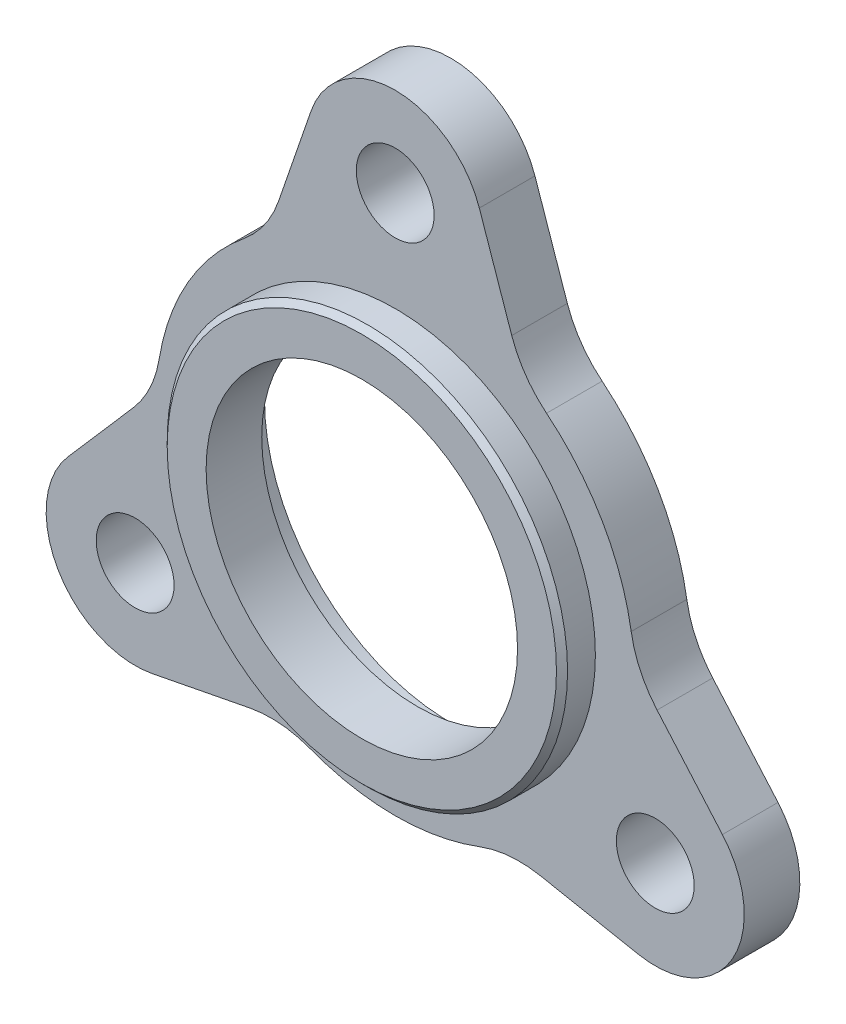
ISO-10303-21;
HEADER;
FILE_DESCRIPTION(('STEP AP214'),'2;1');
FILE_NAME('part.step','',(''),(''),'','','');
FILE_SCHEMA(('AUTOMOTIVE_DESIGN { 1 0 10303 214 1 1 1 1 }'));
ENDSEC;
DATA;
#1=APPLICATION_CONTEXT('core data for automotive mechanical design processes');
#2=APPLICATION_PROTOCOL_DEFINITION('international standard','automotive_design',2000,#1);
#3=PRODUCT_CONTEXT('',#1,'mechanical');
#4=PRODUCT('Part','Part','',(#3));
#5=PRODUCT_RELATED_PRODUCT_CATEGORY('part','',(#4));
#6=PRODUCT_DEFINITION_FORMATION('','',#4);
#7=PRODUCT_DEFINITION_CONTEXT('part definition',#1,'design');
#8=PRODUCT_DEFINITION('design','',#6,#7);
#9=PRODUCT_DEFINITION_SHAPE('','',#8);
#10=(LENGTH_UNIT() NAMED_UNIT(*) SI_UNIT(.MILLI.,.METRE.));
#11=(NAMED_UNIT(*) PLANE_ANGLE_UNIT() SI_UNIT($,.RADIAN.));
#12=(NAMED_UNIT(*) SI_UNIT($,.STERADIAN.) SOLID_ANGLE_UNIT());
#13=UNCERTAINTY_MEASURE_WITH_UNIT(LENGTH_MEASURE(1.E-05),#10,'distance_accuracy_value','');
#14=(GEOMETRIC_REPRESENTATION_CONTEXT(3) GLOBAL_UNCERTAINTY_ASSIGNED_CONTEXT((#13)) GLOBAL_UNIT_ASSIGNED_CONTEXT((#10,
#11,#12)) REPRESENTATION_CONTEXT('',''));
#15=CARTESIAN_POINT('',(0.,0.,0.));
#16=DIRECTION('',(0.,0.,1.));
#17=DIRECTION('',(1.,0.,0.));
#18=AXIS2_PLACEMENT_3D('',#15,#16,#17);
#19=CARTESIAN_POINT('',(0.,0.,-24.));
#20=DIRECTION('',(0.,0.,1.));
#21=DIRECTION('',(1.,0.,0.));
#22=AXIS2_PLACEMENT_3D('',#19,#20,#21);
#23=CYLINDRICAL_SURFACE('',#22,14.);
#24=CARTESIAN_POINT('',(0.,0.,8.));
#25=DIRECTION('',(0.,0.,1.));
#26=DIRECTION('',(1.,0.,0.));
#27=AXIS2_PLACEMENT_3D('',#24,#25,#26);
#28=CIRCLE('',#27,14.);
#29=CARTESIAN_POINT('',(14.,0.,8.));
#30=VERTEX_POINT('',#29);
#31=EDGE_CURVE('E307',#30,#30,#28,.T.);
#32=ORIENTED_EDGE('',*,*,#31,.T.);
#33=EDGE_LOOP('',(#32));
#34=FACE_BOUND('',#33,.T.);
#35=CARTESIAN_POINT('',(0.,0.,3.));
#36=DIRECTION('',(0.,0.,-1.));
#37=DIRECTION('',(-1.,0.,0.));
#38=AXIS2_PLACEMENT_3D('',#35,#36,#37);
#39=CIRCLE('',#38,14.);
#40=CARTESIAN_POINT('',(-14.,0.,3.));
#41=VERTEX_POINT('',#40);
#42=EDGE_CURVE('E305',#41,#41,#39,.F.);
#43=ORIENTED_EDGE('',*,*,#42,.F.);
#44=EDGE_LOOP('',(#43));
#45=FACE_BOUND('',#44,.T.);
#46=ADVANCED_FACE('F36',(#34,#45),#23,.F.);
#47=CARTESIAN_POINT('',(0.,0.,5.));
#48=DIRECTION('',(0.,0.,1.));
#49=DIRECTION('',(1.,0.,0.));
#50=AXIS2_PLACEMENT_3D('',#47,#48,#49);
#51=PLANE('',#50);
#52=CARTESIAN_POINT('',(-23.3826859021781,-13.500000000001,5.));
#53=DIRECTION('',(0.,0.,1.));
#54=DIRECTION('',(1.,0.,0.));
#55=AXIS2_PLACEMENT_3D('',#52,#53,#54);
#56=CIRCLE('',#55,3.50000000000218);
#57=CARTESIAN_POINT('',(-19.8826859021759,-13.500000000001,5.));
#58=VERTEX_POINT('',#57);
#59=EDGE_CURVE('E473',#58,#58,#56,.T.);
#60=ORIENTED_EDGE('',*,*,#59,.F.);
#61=EDGE_LOOP('',(#60));
#62=FACE_BOUND('',#61,.T.);
#63=CARTESIAN_POINT('',(0.,27.,5.));
#64=DIRECTION('',(0.,0.,1.));
#65=DIRECTION('',(1.,0.,0.));
#66=AXIS2_PLACEMENT_3D('',#63,#64,#65);
#67=CIRCLE('',#66,3.5);
#68=CARTESIAN_POINT('',(3.5,27.,5.));
#69=VERTEX_POINT('',#68);
#70=EDGE_CURVE('E218',#69,#69,#67,.T.);
#71=ORIENTED_EDGE('',*,*,#70,.F.);
#72=EDGE_LOOP('',(#71));
#73=FACE_BOUND('',#72,.T.);
#74=DIRECTION('',(-0.656223565148825,0.754566519627903,0.));
#75=VECTOR('',#74,1.);
#76=CARTESIAN_POINT('',(21.4821327225523,0.876341081228575,5.));
#77=LINE('',#76,#75);
#78=CARTESIAN_POINT('',(29.4192180592031,-8.2502114788094,5.));
#79=VERTEX_POINT('',#78);
#80=CARTESIAN_POINT('',(23.5440196558935,-1.49454428434759,5.));
#81=VERTEX_POINT('',#80);
#82=EDGE_CURVE('E212',#79,#81,#77,.T.);
#83=ORIENTED_EDGE('',*,*,#82,.T.);
#84=CARTESIAN_POINT('',(31.0896848521726,5.06769136714065,5.));
#85=DIRECTION('',(0.,0.,1.));
#86=DIRECTION('',(1.,0.,0.));
#87=AXIS2_PLACEMENT_3D('',#84,#85,#86);
#88=CIRCLE('',#87,10.);
#89=CARTESIAN_POINT('',(21.2199436292606,3.45890045693727,5.));
#90=VERTEX_POINT('',#89);
#91=EDGE_CURVE('E293',#81,#90,#88,.F.);
#92=ORIENTED_EDGE('',*,*,#91,.T.);
#93=CARTESIAN_POINT('',(0.,0.,5.));
#94=DIRECTION('',(0.,0.,1.));
#95=DIRECTION('',(1.,0.,0.));
#96=AXIS2_PLACEMENT_3D('',#93,#94,#95);
#97=CIRCLE('',#96,21.5);
#98=CARTESIAN_POINT('',(13.6054674794996,16.6475600213448,5.));
#99=VERTEX_POINT('',#98);
#100=EDGE_CURVE('E176',#90,#99,#97,.T.);
#101=ORIENTED_EDGE('',*,*,#100,.T.);
#102=CARTESIAN_POINT('',(19.9335918885692,24.3906111940634,5.));
#103=DIRECTION('',(0.,0.,1.));
#104=DIRECTION('',(1.,0.,0.));
#105=AXIS2_PLACEMENT_3D('',#102,#103,#104);
#106=CIRCLE('',#105,10.);
#107=CARTESIAN_POINT('',(10.4776965106209,21.1369912713778,5.));
#108=VERTEX_POINT('',#107);
#109=EDGE_CURVE('E172',#99,#108,#106,.F.);
#110=ORIENTED_EDGE('',*,*,#109,.T.);
#111=DIRECTION('',(-0.325361992268561,0.945589537794826,0.));
#112=VECTOR('',#111,1.);
#113=CARTESIAN_POINT('',(11.5,18.1659021245849,5.));
#114=LINE('',#113,#112);
#115=CARTESIAN_POINT('',(7.56471630235861,29.6028959381485,5.));
#116=VERTEX_POINT('',#115);
#117=EDGE_CURVE('E162',#108,#116,#114,.T.);
#118=ORIENTED_EDGE('',*,*,#117,.T.);
#119=CARTESIAN_POINT('',(0.,27.,5.));
#120=DIRECTION('',(0.,0.,1.));
#121=DIRECTION('',(1.,0.,0.));
#122=AXIS2_PLACEMENT_3D('',#119,#120,#121);
#123=CIRCLE('',#122,8.);
#124=CARTESIAN_POINT('',(-7.56471630235861,29.6028959381485,5.));
#125=VERTEX_POINT('',#124);
#126=EDGE_CURVE('E168',#116,#125,#123,.T.);
#127=ORIENTED_EDGE('',*,*,#126,.T.);
#128=DIRECTION('',(-0.325361992268561,-0.945589537794826,0.));
#129=VECTOR('',#128,1.);
#130=CARTESIAN_POINT('',(-11.5,18.1659021245849,5.));
#131=LINE('',#130,#129);
#132=CARTESIAN_POINT('',(-10.4776965106209,21.1369912713778,5.));
#133=VERTEX_POINT('',#132);
#134=EDGE_CURVE('E190',#125,#133,#131,.T.);
#135=ORIENTED_EDGE('',*,*,#134,.T.);
#136=CARTESIAN_POINT('',(-19.9335918885692,24.3906111940634,5.));
#137=DIRECTION('',(0.,0.,1.));
#138=DIRECTION('',(1.,0.,0.));
#139=AXIS2_PLACEMENT_3D('',#136,#137,#138);
#140=CIRCLE('',#139,10.);
#141=CARTESIAN_POINT('',(-13.6054674794996,16.6475600213448,5.));
#142=VERTEX_POINT('',#141);
#143=EDGE_CURVE('E303',#133,#142,#140,.F.);
#144=ORIENTED_EDGE('',*,*,#143,.T.);
#145=CARTESIAN_POINT('',(0.,0.,5.));
#146=DIRECTION('',(0.,0.,1.));
#147=DIRECTION('',(1.,0.,0.));
#148=AXIS2_PLACEMENT_3D('',#145,#146,#147);
#149=CIRCLE('',#148,21.5);
#150=CARTESIAN_POINT('',(-21.2199436292606,3.45890045693726,5.));
#151=VERTEX_POINT('',#150);
#152=EDGE_CURVE('E192',#142,#151,#149,.T.);
#153=ORIENTED_EDGE('',*,*,#152,.T.);
#154=CARTESIAN_POINT('',(-31.0896848521726,5.06769136714064,5.));
#155=DIRECTION('',(0.,0.,1.));
#156=DIRECTION('',(1.,0.,0.));
#157=AXIS2_PLACEMENT_3D('',#154,#155,#156);
#158=CIRCLE('',#157,10.);
#159=CARTESIAN_POINT('',(-23.5440196558935,-1.49454428434761,5.));
#160=VERTEX_POINT('',#159);
#161=EDGE_CURVE('E300',#151,#160,#158,.F.);
#162=ORIENTED_EDGE('',*,*,#161,.T.);
#163=DIRECTION('',(-0.656223565148824,-0.754566519627903,0.));
#164=VECTOR('',#163,1.);
#165=CARTESIAN_POINT('',(-21.4821327225523,0.876341081228558,5.));
#166=LINE('',#165,#164);
#167=CARTESIAN_POINT('',(-29.4192180592031,-8.25021147880942,5.));
#168=VERTEX_POINT('',#167);
#169=EDGE_CURVE('E198',#160,#168,#166,.T.);
#170=ORIENTED_EDGE('',*,*,#169,.T.);
#171=CARTESIAN_POINT('',(-23.3826859021798,-13.5,5.));
#172=DIRECTION('',(0.,0.,1.));
#173=DIRECTION('',(1.,0.,0.));
#174=AXIS2_PLACEMENT_3D('',#171,#172,#173);
#175=CIRCLE('',#174,7.99999999999999);
#176=CARTESIAN_POINT('',(-21.8545017568445,-21.3526844593391,5.));
#177=VERTEX_POINT('',#176);
#178=EDGE_CURVE('E200',#168,#177,#175,.T.);
#179=ORIENTED_EDGE('',*,*,#178,.T.);
#180=DIRECTION('',(0.981585557417385,0.191023018166923,0.));
#181=VECTOR('',#180,1.);
#182=CARTESIAN_POINT('',(-9.98213272255226,-19.0422432058135,5.));
#183=LINE('',#182,#181);
#184=CARTESIAN_POINT('',(-13.0663231452726,-19.6424469870302,5.));
#185=VERTEX_POINT('',#184);
#186=EDGE_CURVE('E202',#177,#185,#183,.T.);
#187=ORIENTED_EDGE('',*,*,#186,.T.);
#188=CARTESIAN_POINT('',(-11.1560929636034,-29.458302561204,5.));
#189=DIRECTION('',(0.,0.,1.));
#190=DIRECTION('',(1.,0.,0.));
#191=AXIS2_PLACEMENT_3D('',#188,#189,#190);
#192=CIRCLE('',#191,10.);
#193=CARTESIAN_POINT('',(-7.61447614976104,-20.1064604782821,5.));
#194=VERTEX_POINT('',#193);
#195=EDGE_CURVE('E285',#185,#194,#192,.F.);
#196=ORIENTED_EDGE('',*,*,#195,.T.);
#197=CARTESIAN_POINT('',(0.,0.,5.));
#198=DIRECTION('',(0.,0.,1.));
#199=DIRECTION('',(1.,0.,0.));
#200=AXIS2_PLACEMENT_3D('',#197,#198,#199);
#201=CIRCLE('',#200,21.5);
#202=CARTESIAN_POINT('',(7.61447614976104,-20.1064604782821,5.));
#203=VERTEX_POINT('',#202);
#204=EDGE_CURVE('E205',#194,#203,#201,.T.);
#205=ORIENTED_EDGE('',*,*,#204,.T.);
#206=CARTESIAN_POINT('',(11.1560929636034,-29.458302561204,5.));
#207=DIRECTION('',(0.,0.,1.));
#208=DIRECTION('',(1.,0.,0.));
#209=AXIS2_PLACEMENT_3D('',#206,#207,#208);
#210=CIRCLE('',#209,10.);
#211=CARTESIAN_POINT('',(13.0663231452726,-19.6424469870302,5.));
#212=VERTEX_POINT('',#211);
#213=EDGE_CURVE('E289',#203,#212,#210,.F.);
#214=ORIENTED_EDGE('',*,*,#213,.T.);
#215=DIRECTION('',(0.981585557417386,-0.191023018166923,0.));
#216=VECTOR('',#215,1.);
#217=CARTESIAN_POINT('',(9.98213272255228,-19.0422432058135,5.));
#218=LINE('',#217,#216);
#219=CARTESIAN_POINT('',(21.8545017568445,-21.3526844593391,5.));
#220=VERTEX_POINT('',#219);
#221=EDGE_CURVE('E208',#212,#220,#218,.T.);
#222=ORIENTED_EDGE('',*,*,#221,.T.);
#223=CARTESIAN_POINT('',(23.3826859021799,-13.5,5.));
#224=DIRECTION('',(0.,0.,1.));
#225=DIRECTION('',(1.,0.,0.));
#226=AXIS2_PLACEMENT_3D('',#223,#224,#225);
#227=CIRCLE('',#226,8.);
#228=EDGE_CURVE('E210',#220,#79,#227,.T.);
#229=ORIENTED_EDGE('',*,*,#228,.T.);
#230=EDGE_LOOP('',(#83,#92,#101,#110,#118,#127,#135,#144,#153,#162,#170,#179,#187,#196,#205,
#214,#222,#229));
#231=FACE_BOUND('',#230,.T.);
#232=CARTESIAN_POINT('',(23.3826859021816,-13.499999999999,5.));
#233=DIRECTION('',(0.,0.,1.));
#234=DIRECTION('',(1.,0.,0.));
#235=AXIS2_PLACEMENT_3D('',#232,#233,#234);
#236=CIRCLE('',#235,3.50000000000148);
#237=CARTESIAN_POINT('',(26.882685902183,-13.499999999999,5.));
#238=VERTEX_POINT('',#237);
#239=EDGE_CURVE('E467',#238,#238,#236,.T.);
#240=ORIENTED_EDGE('',*,*,#239,.F.);
#241=EDGE_LOOP('',(#240));
#242=FACE_BOUND('',#241,.T.);
#243=CARTESIAN_POINT('',(0.,0.,5.));
#244=DIRECTION('',(0.,0.,1.));
#245=DIRECTION('',(1.,0.,0.));
#246=AXIS2_PLACEMENT_3D('',#243,#244,#245);
#247=CIRCLE('',#246,18.);
#248=CARTESIAN_POINT('',(18.,0.,5.));
#249=VERTEX_POINT('',#248);
#250=EDGE_CURVE('E479',#249,#249,#247,.T.);
#251=ORIENTED_EDGE('',*,*,#250,.F.);
#252=EDGE_LOOP('',(#251));
#253=FACE_BOUND('',#252,.T.);
#254=ADVANCED_FACE('F165',(#62,#73,#231,#242,#253),#51,.T.);
#255=CARTESIAN_POINT('',(0.,0.,0.));
#256=DIRECTION('',(0.,0.,1.));
#257=DIRECTION('',(1.,0.,0.));
#258=AXIS2_PLACEMENT_3D('',#255,#256,#257);
#259=PLANE('',#258);
#260=CARTESIAN_POINT('',(0.,0.,0.));
#261=DIRECTION('',(0.,0.,-1.));
#262=DIRECTION('',(-1.,0.,0.));
#263=AXIS2_PLACEMENT_3D('',#260,#261,#262);
#264=CIRCLE('',#263,16.75);
#265=CARTESIAN_POINT('',(-16.75,0.,0.));
#266=VERTEX_POINT('',#265);
#267=EDGE_CURVE('E485',#266,#266,#264,.T.);
#268=ORIENTED_EDGE('',*,*,#267,.F.);
#269=EDGE_LOOP('',(#268));
#270=FACE_BOUND('',#269,.T.);
#271=CARTESIAN_POINT('',(23.3826859021816,-13.499999999999,0.));
#272=DIRECTION('',(0.,0.,1.));
#273=DIRECTION('',(1.,0.,0.));
#274=AXIS2_PLACEMENT_3D('',#271,#272,#273);
#275=CIRCLE('',#274,3.50000000000148);
#276=CARTESIAN_POINT('',(26.882685902183,-13.499999999999,0.));
#277=VERTEX_POINT('',#276);
#278=EDGE_CURVE('E470',#277,#277,#275,.T.);
#279=ORIENTED_EDGE('',*,*,#278,.T.);
#280=EDGE_LOOP('',(#279));
#281=FACE_BOUND('',#280,.T.);
#282=CARTESIAN_POINT('',(0.,0.,0.));
#283=DIRECTION('',(0.,0.,1.));
#284=DIRECTION('',(1.,0.,0.));
#285=AXIS2_PLACEMENT_3D('',#282,#283,#284);
#286=CIRCLE('',#285,21.5);
#287=CARTESIAN_POINT('',(21.2199436292606,3.45890045693727,0.));
#288=VERTEX_POINT('',#287);
#289=CARTESIAN_POINT('',(13.6054674794996,16.6475600213448,0.));
#290=VERTEX_POINT('',#289);
#291=EDGE_CURVE('E215',#288,#290,#286,.T.);
#292=ORIENTED_EDGE('',*,*,#291,.F.);
#293=CARTESIAN_POINT('',(31.0896848521726,5.06769136714065,0.));
#294=DIRECTION('',(0.,0.,1.));
#295=DIRECTION('',(1.,0.,0.));
#296=AXIS2_PLACEMENT_3D('',#293,#294,#295);
#297=CIRCLE('',#296,10.);
#298=CARTESIAN_POINT('',(23.5440196558935,-1.49454428434759,0.));
#299=VERTEX_POINT('',#298);
#300=EDGE_CURVE('E291',#288,#299,#297,.T.);
#301=ORIENTED_EDGE('',*,*,#300,.T.);
#302=DIRECTION('',(-0.656223565148825,0.754566519627903,0.));
#303=VECTOR('',#302,1.);
#304=CARTESIAN_POINT('',(21.4821327225523,0.876341081228575,0.));
#305=LINE('',#304,#303);
#306=CARTESIAN_POINT('',(29.4192180592031,-8.2502114788094,0.));
#307=VERTEX_POINT('',#306);
#308=EDGE_CURVE('E241',#307,#299,#305,.T.);
#309=ORIENTED_EDGE('',*,*,#308,.F.);
#310=CARTESIAN_POINT('',(23.3826859021799,-13.5,0.));
#311=DIRECTION('',(0.,0.,1.));
#312=DIRECTION('',(1.,0.,0.));
#313=AXIS2_PLACEMENT_3D('',#310,#311,#312);
#314=CIRCLE('',#313,8.);
#315=CARTESIAN_POINT('',(21.8545017568445,-21.3526844593391,0.));
#316=VERTEX_POINT('',#315);
#317=EDGE_CURVE('E239',#316,#307,#314,.T.);
#318=ORIENTED_EDGE('',*,*,#317,.F.);
#319=DIRECTION('',(0.981585557417386,-0.191023018166923,0.));
#320=VECTOR('',#319,1.);
#321=CARTESIAN_POINT('',(9.98213272255228,-19.0422432058135,0.));
#322=LINE('',#321,#320);
#323=CARTESIAN_POINT('',(13.0663231452726,-19.6424469870302,0.));
#324=VERTEX_POINT('',#323);
#325=EDGE_CURVE('E237',#324,#316,#322,.T.);
#326=ORIENTED_EDGE('',*,*,#325,.F.);
#327=CARTESIAN_POINT('',(11.1560929636034,-29.458302561204,0.));
#328=DIRECTION('',(0.,0.,1.));
#329=DIRECTION('',(1.,0.,0.));
#330=AXIS2_PLACEMENT_3D('',#327,#328,#329);
#331=CIRCLE('',#330,10.);
#332=CARTESIAN_POINT('',(7.61447614976104,-20.1064604782821,0.));
#333=VERTEX_POINT('',#332);
#334=EDGE_CURVE('E287',#324,#333,#331,.T.);
#335=ORIENTED_EDGE('',*,*,#334,.T.);
#336=CARTESIAN_POINT('',(0.,0.,0.));
#337=DIRECTION('',(0.,0.,1.));
#338=DIRECTION('',(1.,0.,0.));
#339=AXIS2_PLACEMENT_3D('',#336,#337,#338);
#340=CIRCLE('',#339,21.5);
#341=CARTESIAN_POINT('',(-7.61447614976104,-20.1064604782821,0.));
#342=VERTEX_POINT('',#341);
#343=EDGE_CURVE('E234',#342,#333,#340,.T.);
#344=ORIENTED_EDGE('',*,*,#343,.F.);
#345=CARTESIAN_POINT('',(-11.1560929636034,-29.458302561204,0.));
#346=DIRECTION('',(0.,0.,1.));
#347=DIRECTION('',(1.,0.,0.));
#348=AXIS2_PLACEMENT_3D('',#345,#346,#347);
#349=CIRCLE('',#348,10.);
#350=CARTESIAN_POINT('',(-13.0663231452726,-19.6424469870302,0.));
#351=VERTEX_POINT('',#350);
#352=EDGE_CURVE('E283',#342,#351,#349,.T.);
#353=ORIENTED_EDGE('',*,*,#352,.T.);
#354=DIRECTION('',(0.981585557417385,0.191023018166923,0.));
#355=VECTOR('',#354,1.);
#356=CARTESIAN_POINT('',(-9.98213272255226,-19.0422432058135,0.));
#357=LINE('',#356,#355);
#358=CARTESIAN_POINT('',(-21.8545017568445,-21.3526844593391,0.));
#359=VERTEX_POINT('',#358);
#360=EDGE_CURVE('E231',#359,#351,#357,.T.);
#361=ORIENTED_EDGE('',*,*,#360,.F.);
#362=CARTESIAN_POINT('',(-23.3826859021798,-13.5,0.));
#363=DIRECTION('',(0.,0.,1.));
#364=DIRECTION('',(1.,0.,0.));
#365=AXIS2_PLACEMENT_3D('',#362,#363,#364);
#366=CIRCLE('',#365,7.99999999999999);
#367=CARTESIAN_POINT('',(-29.4192180592031,-8.25021147880942,0.));
#368=VERTEX_POINT('',#367);
#369=EDGE_CURVE('E229',#368,#359,#366,.T.);
#370=ORIENTED_EDGE('',*,*,#369,.F.);
#371=DIRECTION('',(-0.656223565148824,-0.754566519627903,0.));
#372=VECTOR('',#371,1.);
#373=CARTESIAN_POINT('',(-21.4821327225523,0.876341081228558,0.));
#374=LINE('',#373,#372);
#375=CARTESIAN_POINT('',(-23.5440196558935,-1.49454428434761,0.));
#376=VERTEX_POINT('',#375);
#377=EDGE_CURVE('E227',#376,#368,#374,.T.);
#378=ORIENTED_EDGE('',*,*,#377,.F.);
#379=CARTESIAN_POINT('',(-31.0896848521726,5.06769136714064,0.));
#380=DIRECTION('',(0.,0.,1.));
#381=DIRECTION('',(1.,0.,0.));
#382=AXIS2_PLACEMENT_3D('',#379,#380,#381);
#383=CIRCLE('',#382,10.);
#384=CARTESIAN_POINT('',(-21.2199436292606,3.45890045693726,0.));
#385=VERTEX_POINT('',#384);
#386=EDGE_CURVE('E298',#376,#385,#383,.T.);
#387=ORIENTED_EDGE('',*,*,#386,.T.);
#388=CARTESIAN_POINT('',(0.,0.,0.));
#389=DIRECTION('',(0.,0.,1.));
#390=DIRECTION('',(1.,0.,0.));
#391=AXIS2_PLACEMENT_3D('',#388,#389,#390);
#392=CIRCLE('',#391,21.5);
#393=CARTESIAN_POINT('',(-13.6054674794996,16.6475600213448,0.));
#394=VERTEX_POINT('',#393);
#395=EDGE_CURVE('E224',#394,#385,#392,.T.);
#396=ORIENTED_EDGE('',*,*,#395,.F.);
#397=CARTESIAN_POINT('',(-19.9335918885692,24.3906111940634,0.));
#398=DIRECTION('',(0.,0.,1.));
#399=DIRECTION('',(1.,0.,0.));
#400=AXIS2_PLACEMENT_3D('',#397,#398,#399);
#401=CIRCLE('',#400,10.);
#402=CARTESIAN_POINT('',(-10.4776965106209,21.1369912713778,0.));
#403=VERTEX_POINT('',#402);
#404=EDGE_CURVE('E59',#394,#403,#401,.T.);
#405=ORIENTED_EDGE('',*,*,#404,.T.);
#406=DIRECTION('',(-0.325361992268561,-0.945589537794826,0.));
#407=VECTOR('',#406,1.);
#408=CARTESIAN_POINT('',(-11.5,18.1659021245849,0.));
#409=LINE('',#408,#407);
#410=CARTESIAN_POINT('',(-7.56471630235861,29.6028959381485,0.));
#411=VERTEX_POINT('',#410);
#412=EDGE_CURVE('E222',#411,#403,#409,.T.);
#413=ORIENTED_EDGE('',*,*,#412,.F.);
#414=CARTESIAN_POINT('',(0.,27.,0.));
#415=DIRECTION('',(0.,0.,1.));
#416=DIRECTION('',(1.,0.,0.));
#417=AXIS2_PLACEMENT_3D('',#414,#415,#416);
#418=CIRCLE('',#417,8.);
#419=CARTESIAN_POINT('',(7.56471630235861,29.6028959381485,0.));
#420=VERTEX_POINT('',#419);
#421=EDGE_CURVE('E220',#420,#411,#418,.T.);
#422=ORIENTED_EDGE('',*,*,#421,.F.);
#423=DIRECTION('',(-0.325361992268561,0.945589537794826,0.));
#424=VECTOR('',#423,1.);
#425=CARTESIAN_POINT('',(11.5,18.1659021245849,0.));
#426=LINE('',#425,#424);
#427=CARTESIAN_POINT('',(10.4776965106209,21.1369912713778,0.));
#428=VERTEX_POINT('',#427);
#429=EDGE_CURVE('E182',#428,#420,#426,.T.);
#430=ORIENTED_EDGE('',*,*,#429,.F.);
#431=CARTESIAN_POINT('',(19.9335918885692,24.3906111940634,0.));
#432=DIRECTION('',(0.,0.,1.));
#433=DIRECTION('',(1.,0.,0.));
#434=AXIS2_PLACEMENT_3D('',#431,#432,#433);
#435=CIRCLE('',#434,10.);
#436=EDGE_CURVE('E295',#428,#290,#435,.T.);
#437=ORIENTED_EDGE('',*,*,#436,.T.);
#438=EDGE_LOOP('',(#292,#301,#309,#318,#326,#335,#344,#353,#361,#370,#378,#387,#396,#405,#413,
#422,#430,#437));
#439=FACE_BOUND('',#438,.T.);
#440=CARTESIAN_POINT('',(0.,27.,0.));
#441=DIRECTION('',(0.,0.,1.));
#442=DIRECTION('',(1.,0.,0.));
#443=AXIS2_PLACEMENT_3D('',#440,#441,#442);
#444=CIRCLE('',#443,3.5);
#445=CARTESIAN_POINT('',(3.5,27.,0.));
#446=VERTEX_POINT('',#445);
#447=EDGE_CURVE('E464',#446,#446,#444,.T.);
#448=ORIENTED_EDGE('',*,*,#447,.T.);
#449=EDGE_LOOP('',(#448));
#450=FACE_BOUND('',#449,.T.);
#451=CARTESIAN_POINT('',(-23.3826859021781,-13.500000000001,0.));
#452=DIRECTION('',(0.,0.,1.));
#453=DIRECTION('',(1.,0.,0.));
#454=AXIS2_PLACEMENT_3D('',#451,#452,#453);
#455=CIRCLE('',#454,3.50000000000218);
#456=CARTESIAN_POINT('',(-19.8826859021759,-13.500000000001,0.));
#457=VERTEX_POINT('',#456);
#458=EDGE_CURVE('E476',#457,#457,#455,.T.);
#459=ORIENTED_EDGE('',*,*,#458,.T.);
#460=EDGE_LOOP('',(#459));
#461=FACE_BOUND('',#460,.T.);
#462=ADVANCED_FACE('F331',(#270,#281,#439,#450,#461),#259,.F.);
#463=CARTESIAN_POINT('',(0.,0.,5.));
#464=DIRECTION('',(0.,0.,-1.));
#465=DIRECTION('',(-1.,0.,0.));
#466=AXIS2_PLACEMENT_3D('',#463,#464,#465);
#467=CYLINDRICAL_SURFACE('',#466,21.5);
#468=ORIENTED_EDGE('',*,*,#100,.F.);
#469=DIRECTION('',(0.,0.,-1.));
#470=VECTOR('',#469,1.);
#471=CARTESIAN_POINT('',(21.2199436292606,3.45890045693727,5.));
#472=LINE('',#471,#470);
#473=EDGE_CURVE('E267',#90,#288,#472,.T.);
#474=ORIENTED_EDGE('',*,*,#473,.T.);
#475=ORIENTED_EDGE('',*,*,#291,.T.);
#476=DIRECTION('',(0.,0.,-1.));
#477=VECTOR('',#476,1.);
#478=CARTESIAN_POINT('',(13.6054674794996,16.6475600213448,5.));
#479=LINE('',#478,#477);
#480=EDGE_CURVE('E265',#290,#99,#479,.F.);
#481=ORIENTED_EDGE('',*,*,#480,.T.);
#482=EDGE_LOOP('',(#468,#474,#475,#481));
#483=FACE_BOUND('',#482,.T.);
#484=ADVANCED_FACE('F361',(#483),#467,.T.);
#485=CARTESIAN_POINT('',(11.5,18.1659021245849,5.));
#486=DIRECTION('',(-0.945589537794826,-0.325361992268561,0.));
#487=DIRECTION('',(0.325361992268561,-0.945589537794826,0.));
#488=AXIS2_PLACEMENT_3D('',#485,#486,#487);
#489=PLANE('',#488);
#490=ORIENTED_EDGE('',*,*,#117,.F.);
#491=DIRECTION('',(0.,0.,1.));
#492=VECTOR('',#491,1.);
#493=CARTESIAN_POINT('',(10.4776965106209,21.1369912713778,0.));
#494=LINE('',#493,#492);
#495=EDGE_CURVE('E272',#108,#428,#494,.F.);
#496=ORIENTED_EDGE('',*,*,#495,.T.);
#497=ORIENTED_EDGE('',*,*,#429,.T.);
#498=DIRECTION('',(0.,0.,-1.));
#499=VECTOR('',#498,1.);
#500=CARTESIAN_POINT('',(7.56471630235861,29.6028959381485,5.));
#501=LINE('',#500,#499);
#502=EDGE_CURVE('E179',#116,#420,#501,.T.);
#503=ORIENTED_EDGE('',*,*,#502,.F.);
#504=EDGE_LOOP('',(#490,#496,#497,#503));
#505=FACE_BOUND('',#504,.T.);
#506=ADVANCED_FACE('F180',(#505),#489,.F.);
#507=CARTESIAN_POINT('',(0.,27.,5.));
#508=DIRECTION('',(0.,0.,-1.));
#509=DIRECTION('',(-1.,0.,0.));
#510=AXIS2_PLACEMENT_3D('',#507,#508,#509);
#511=CYLINDRICAL_SURFACE('',#510,8.);
#512=ORIENTED_EDGE('',*,*,#421,.T.);
#513=DIRECTION('',(0.,0.,-1.));
#514=VECTOR('',#513,1.);
#515=CARTESIAN_POINT('',(-7.56471630235861,29.6028959381485,5.));
#516=LINE('',#515,#514);
#517=EDGE_CURVE('E186',#125,#411,#516,.T.);
#518=ORIENTED_EDGE('',*,*,#517,.F.);
#519=ORIENTED_EDGE('',*,*,#126,.F.);
#520=ORIENTED_EDGE('',*,*,#502,.T.);
#521=EDGE_LOOP('',(#512,#518,#519,#520));
#522=FACE_BOUND('',#521,.T.);
#523=ADVANCED_FACE('F188',(#522),#511,.T.);
#524=CARTESIAN_POINT('',(-11.5,18.1659021245849,5.));
#525=DIRECTION('',(0.945589537794826,-0.325361992268561,0.));
#526=DIRECTION('',(0.325361992268561,0.945589537794826,0.));
#527=AXIS2_PLACEMENT_3D('',#524,#525,#526);
#528=PLANE('',#527);
#529=ORIENTED_EDGE('',*,*,#412,.T.);
#530=DIRECTION('',(0.,0.,1.));
#531=VECTOR('',#530,1.);
#532=CARTESIAN_POINT('',(-10.4776965106209,21.1369912713778,5.));
#533=LINE('',#532,#531);
#534=EDGE_CURVE('E51',#403,#133,#533,.T.);
#535=ORIENTED_EDGE('',*,*,#534,.T.);
#536=ORIENTED_EDGE('',*,*,#134,.F.);
#537=ORIENTED_EDGE('',*,*,#517,.T.);
#538=EDGE_LOOP('',(#529,#535,#536,#537));
#539=FACE_BOUND('',#538,.T.);
#540=ADVANCED_FACE('F393',(#539),#528,.F.);
#541=CARTESIAN_POINT('',(0.,0.,5.));
#542=DIRECTION('',(0.,0.,-1.));
#543=DIRECTION('',(-1.,0.,0.));
#544=AXIS2_PLACEMENT_3D('',#541,#542,#543);
#545=CYLINDRICAL_SURFACE('',#544,21.5);
#546=ORIENTED_EDGE('',*,*,#395,.T.);
#547=DIRECTION('',(0.,0.,-1.));
#548=VECTOR('',#547,1.);
#549=CARTESIAN_POINT('',(-21.2199436292606,3.45890045693726,5.));
#550=LINE('',#549,#548);
#551=EDGE_CURVE('E280',#385,#151,#550,.F.);
#552=ORIENTED_EDGE('',*,*,#551,.T.);
#553=ORIENTED_EDGE('',*,*,#152,.F.);
#554=DIRECTION('',(0.,0.,-1.));
#555=VECTOR('',#554,1.);
#556=CARTESIAN_POINT('',(-13.6054674794996,16.6475600213448,5.));
#557=LINE('',#556,#555);
#558=EDGE_CURVE('E277',#142,#394,#557,.T.);
#559=ORIENTED_EDGE('',*,*,#558,.T.);
#560=EDGE_LOOP('',(#546,#552,#553,#559));
#561=FACE_BOUND('',#560,.T.);
#562=ADVANCED_FACE('F389',(#561),#545,.T.);
#563=CARTESIAN_POINT('',(-21.4821327225523,0.876341081228558,5.));
#564=DIRECTION('',(0.754566519627903,-0.656223565148824,0.));
#565=DIRECTION('',(0.656223565148824,0.754566519627903,0.));
#566=AXIS2_PLACEMENT_3D('',#563,#564,#565);
#567=PLANE('',#566);
#568=ORIENTED_EDGE('',*,*,#169,.F.);
#569=DIRECTION('',(0.,0.,1.));
#570=VECTOR('',#569,1.);
#571=CARTESIAN_POINT('',(-23.5440196558935,-1.49454428434761,0.));
#572=LINE('',#571,#570);
#573=EDGE_CURVE('E274',#160,#376,#572,.F.);
#574=ORIENTED_EDGE('',*,*,#573,.T.);
#575=ORIENTED_EDGE('',*,*,#377,.T.);
#576=DIRECTION('',(0.,0.,-1.));
#577=VECTOR('',#576,1.);
#578=CARTESIAN_POINT('',(-29.4192180592031,-8.25021147880942,5.));
#579=LINE('',#578,#577);
#580=EDGE_CURVE('E252',#168,#368,#579,.T.);
#581=ORIENTED_EDGE('',*,*,#580,.F.);
#582=EDGE_LOOP('',(#568,#574,#575,#581));
#583=FACE_BOUND('',#582,.T.);
#584=ADVANCED_FACE('F385',(#583),#567,.F.);
#585=CARTESIAN_POINT('',(-23.3826859021798,-13.5,5.));
#586=DIRECTION('',(0.,0.,-1.));
#587=DIRECTION('',(-1.,0.,0.));
#588=AXIS2_PLACEMENT_3D('',#585,#586,#587);
#589=CYLINDRICAL_SURFACE('',#588,7.99999999999999);
#590=ORIENTED_EDGE('',*,*,#369,.T.);
#591=DIRECTION('',(0.,0.,-1.));
#592=VECTOR('',#591,1.);
#593=CARTESIAN_POINT('',(-21.8545017568445,-21.3526844593391,5.));
#594=LINE('',#593,#592);
#595=EDGE_CURVE('E249',#177,#359,#594,.T.);
#596=ORIENTED_EDGE('',*,*,#595,.F.);
#597=ORIENTED_EDGE('',*,*,#178,.F.);
#598=ORIENTED_EDGE('',*,*,#580,.T.);
#599=EDGE_LOOP('',(#590,#596,#597,#598));
#600=FACE_BOUND('',#599,.T.);
#601=ADVANCED_FACE('F381',(#600),#589,.T.);
#602=CARTESIAN_POINT('',(-9.98213272255226,-19.0422432058135,5.));
#603=DIRECTION('',(-0.191023018166923,0.981585557417385,0.));
#604=DIRECTION('',(-0.981585557417386,-0.191023018166923,0.));
#605=AXIS2_PLACEMENT_3D('',#602,#603,#604);
#606=PLANE('',#605);
#607=ORIENTED_EDGE('',*,*,#360,.T.);
#608=DIRECTION('',(0.,0.,1.));
#609=VECTOR('',#608,1.);
#610=CARTESIAN_POINT('',(-13.0663231452726,-19.6424469870302,5.));
#611=LINE('',#610,#609);
#612=EDGE_CURVE('E260',#351,#185,#611,.T.);
#613=ORIENTED_EDGE('',*,*,#612,.T.);
#614=ORIENTED_EDGE('',*,*,#186,.F.);
#615=ORIENTED_EDGE('',*,*,#595,.T.);
#616=EDGE_LOOP('',(#607,#613,#614,#615));
#617=FACE_BOUND('',#616,.T.);
#618=ADVANCED_FACE('F377',(#617),#606,.F.);
#619=CARTESIAN_POINT('',(0.,0.,5.));
#620=DIRECTION('',(0.,0.,-1.));
#621=DIRECTION('',(-1.,0.,0.));
#622=AXIS2_PLACEMENT_3D('',#619,#620,#621);
#623=CYLINDRICAL_SURFACE('',#622,21.5);
#624=ORIENTED_EDGE('',*,*,#204,.F.);
#625=DIRECTION('',(0.,0.,-1.));
#626=VECTOR('',#625,1.);
#627=CARTESIAN_POINT('',(-7.61447614976104,-20.1064604782821,5.));
#628=LINE('',#627,#626);
#629=EDGE_CURVE('E257',#194,#342,#628,.T.);
#630=ORIENTED_EDGE('',*,*,#629,.T.);
#631=ORIENTED_EDGE('',*,*,#343,.T.);
#632=DIRECTION('',(0.,0.,-1.));
#633=VECTOR('',#632,1.);
#634=CARTESIAN_POINT('',(7.61447614976104,-20.1064604782821,5.));
#635=LINE('',#634,#633);
#636=EDGE_CURVE('E185',#333,#203,#635,.F.);
#637=ORIENTED_EDGE('',*,*,#636,.T.);
#638=EDGE_LOOP('',(#624,#630,#631,#637));
#639=FACE_BOUND('',#638,.T.);
#640=ADVANCED_FACE('F373',(#639),#623,.T.);
#641=CARTESIAN_POINT('',(9.98213272255228,-19.0422432058135,5.));
#642=DIRECTION('',(0.191023018166923,0.981585557417386,0.));
#643=DIRECTION('',(-0.981585557417386,0.191023018166923,0.));
#644=AXIS2_PLACEMENT_3D('',#641,#642,#643);
#645=PLANE('',#644);
#646=ORIENTED_EDGE('',*,*,#221,.F.);
#647=DIRECTION('',(0.,0.,1.));
#648=VECTOR('',#647,1.);
#649=CARTESIAN_POINT('',(13.0663231452726,-19.6424469870302,0.));
#650=LINE('',#649,#648);
#651=EDGE_CURVE('E262',#212,#324,#650,.F.);
#652=ORIENTED_EDGE('',*,*,#651,.T.);
#653=ORIENTED_EDGE('',*,*,#325,.T.);
#654=DIRECTION('',(0.,0.,-1.));
#655=VECTOR('',#654,1.);
#656=CARTESIAN_POINT('',(21.8545017568445,-21.3526844593391,5.));
#657=LINE('',#656,#655);
#658=EDGE_CURVE('E246',#220,#316,#657,.T.);
#659=ORIENTED_EDGE('',*,*,#658,.F.);
#660=EDGE_LOOP('',(#646,#652,#653,#659));
#661=FACE_BOUND('',#660,.T.);
#662=ADVANCED_FACE('F369',(#661),#645,.F.);
#663=CARTESIAN_POINT('',(23.3826859021799,-13.5,5.));
#664=DIRECTION('',(0.,0.,-1.));
#665=DIRECTION('',(-1.,0.,0.));
#666=AXIS2_PLACEMENT_3D('',#663,#664,#665);
#667=CYLINDRICAL_SURFACE('',#666,8.);
#668=ORIENTED_EDGE('',*,*,#317,.T.);
#669=DIRECTION('',(0.,0.,-1.));
#670=VECTOR('',#669,1.);
#671=CARTESIAN_POINT('',(29.4192180592031,-8.2502114788094,5.));
#672=LINE('',#671,#670);
#673=EDGE_CURVE('E214',#79,#307,#672,.T.);
#674=ORIENTED_EDGE('',*,*,#673,.F.);
#675=ORIENTED_EDGE('',*,*,#228,.F.);
#676=ORIENTED_EDGE('',*,*,#658,.T.);
#677=EDGE_LOOP('',(#668,#674,#675,#676));
#678=FACE_BOUND('',#677,.T.);
#679=ADVANCED_FACE('F365',(#678),#667,.T.);
#680=CARTESIAN_POINT('',(21.4821327225523,0.876341081228575,5.));
#681=DIRECTION('',(-0.754566519627903,-0.656223565148825,0.));
#682=DIRECTION('',(0.656223565148825,-0.754566519627903,0.));
#683=AXIS2_PLACEMENT_3D('',#680,#681,#682);
#684=PLANE('',#683);
#685=ORIENTED_EDGE('',*,*,#308,.T.);
#686=DIRECTION('',(0.,0.,1.));
#687=VECTOR('',#686,1.);
#688=CARTESIAN_POINT('',(23.5440196558935,-1.49454428434759,5.));
#689=LINE('',#688,#687);
#690=EDGE_CURVE('E270',#299,#81,#689,.T.);
#691=ORIENTED_EDGE('',*,*,#690,.T.);
#692=ORIENTED_EDGE('',*,*,#82,.F.);
#693=ORIENTED_EDGE('',*,*,#673,.T.);
#694=EDGE_LOOP('',(#685,#691,#692,#693));
#695=FACE_BOUND('',#694,.T.);
#696=ADVANCED_FACE('F356',(#695),#684,.F.);
#697=CARTESIAN_POINT('',(0.,27.,5.));
#698=DIRECTION('',(0.,0.,-1.));
#699=DIRECTION('',(-1.,0.,0.));
#700=AXIS2_PLACEMENT_3D('',#697,#698,#699);
#701=CYLINDRICAL_SURFACE('',#700,3.5);
#702=ORIENTED_EDGE('',*,*,#70,.T.);
#703=EDGE_LOOP('',(#702));
#704=FACE_BOUND('',#703,.T.);
#705=ORIENTED_EDGE('',*,*,#447,.F.);
#706=EDGE_LOOP('',(#705));
#707=FACE_BOUND('',#706,.T.);
#708=ADVANCED_FACE('F353',(#704,#707),#701,.F.);
#709=CARTESIAN_POINT('',(23.3826859021816,-13.499999999999,5.));
#710=DIRECTION('',(0.,0.,-1.));
#711=DIRECTION('',(-1.,0.,0.));
#712=AXIS2_PLACEMENT_3D('',#709,#710,#711);
#713=CYLINDRICAL_SURFACE('',#712,3.50000000000148);
#714=ORIENTED_EDGE('',*,*,#239,.T.);
#715=EDGE_LOOP('',(#714));
#716=FACE_BOUND('',#715,.T.);
#717=ORIENTED_EDGE('',*,*,#278,.F.);
#718=EDGE_LOOP('',(#717));
#719=FACE_BOUND('',#718,.T.);
#720=ADVANCED_FACE('F349',(#716,#719),#713,.F.);
#721=CARTESIAN_POINT('',(-23.3826859021781,-13.500000000001,5.));
#722=DIRECTION('',(0.,0.,-1.));
#723=DIRECTION('',(-1.,0.,0.));
#724=AXIS2_PLACEMENT_3D('',#721,#722,#723);
#725=CYLINDRICAL_SURFACE('',#724,3.50000000000218);
#726=ORIENTED_EDGE('',*,*,#59,.T.);
#727=EDGE_LOOP('',(#726));
#728=FACE_BOUND('',#727,.T.);
#729=ORIENTED_EDGE('',*,*,#458,.F.);
#730=EDGE_LOOP('',(#729));
#731=FACE_BOUND('',#730,.T.);
#732=ADVANCED_FACE('F345',(#728,#731),#725,.F.);
#733=CARTESIAN_POINT('',(-11.1560929636034,-29.458302561204,5.));
#734=DIRECTION('',(0.,0.,-1.));
#735=DIRECTION('',(-1.,0.,0.));
#736=AXIS2_PLACEMENT_3D('',#733,#734,#735);
#737=CYLINDRICAL_SURFACE('',#736,10.);
#738=ORIENTED_EDGE('',*,*,#195,.F.);
#739=ORIENTED_EDGE('',*,*,#612,.F.);
#740=ORIENTED_EDGE('',*,*,#352,.F.);
#741=ORIENTED_EDGE('',*,*,#629,.F.);
#742=EDGE_LOOP('',(#738,#739,#740,#741));
#743=FACE_BOUND('',#742,.T.);
#744=ADVANCED_FACE('F348',(#743),#737,.F.);
#745=CARTESIAN_POINT('',(11.1560929636034,-29.458302561204,5.));
#746=DIRECTION('',(0.,0.,-1.));
#747=DIRECTION('',(-1.,0.,0.));
#748=AXIS2_PLACEMENT_3D('',#745,#746,#747);
#749=CYLINDRICAL_SURFACE('',#748,10.);
#750=ORIENTED_EDGE('',*,*,#213,.F.);
#751=ORIENTED_EDGE('',*,*,#636,.F.);
#752=ORIENTED_EDGE('',*,*,#334,.F.);
#753=ORIENTED_EDGE('',*,*,#651,.F.);
#754=EDGE_LOOP('',(#750,#751,#752,#753));
#755=FACE_BOUND('',#754,.T.);
#756=ADVANCED_FACE('F406',(#755),#749,.F.);
#757=CARTESIAN_POINT('',(31.0896848521726,5.06769136714065,5.));
#758=DIRECTION('',(0.,0.,-1.));
#759=DIRECTION('',(-1.,0.,0.));
#760=AXIS2_PLACEMENT_3D('',#757,#758,#759);
#761=CYLINDRICAL_SURFACE('',#760,10.);
#762=ORIENTED_EDGE('',*,*,#91,.F.);
#763=ORIENTED_EDGE('',*,*,#690,.F.);
#764=ORIENTED_EDGE('',*,*,#300,.F.);
#765=ORIENTED_EDGE('',*,*,#473,.F.);
#766=EDGE_LOOP('',(#762,#763,#764,#765));
#767=FACE_BOUND('',#766,.T.);
#768=ADVANCED_FACE('F410',(#767),#761,.F.);
#769=CARTESIAN_POINT('',(19.9335918885692,24.3906111940634,5.));
#770=DIRECTION('',(0.,0.,-1.));
#771=DIRECTION('',(-1.,0.,0.));
#772=AXIS2_PLACEMENT_3D('',#769,#770,#771);
#773=CYLINDRICAL_SURFACE('',#772,10.);
#774=ORIENTED_EDGE('',*,*,#109,.F.);
#775=ORIENTED_EDGE('',*,*,#480,.F.);
#776=ORIENTED_EDGE('',*,*,#436,.F.);
#777=ORIENTED_EDGE('',*,*,#495,.F.);
#778=EDGE_LOOP('',(#774,#775,#776,#777));
#779=FACE_BOUND('',#778,.T.);
#780=ADVANCED_FACE('F414',(#779),#773,.F.);
#781=CARTESIAN_POINT('',(-31.0896848521726,5.06769136714064,5.));
#782=DIRECTION('',(0.,0.,-1.));
#783=DIRECTION('',(-1.,0.,0.));
#784=AXIS2_PLACEMENT_3D('',#781,#782,#783);
#785=CYLINDRICAL_SURFACE('',#784,10.);
#786=ORIENTED_EDGE('',*,*,#161,.F.);
#787=ORIENTED_EDGE('',*,*,#551,.F.);
#788=ORIENTED_EDGE('',*,*,#386,.F.);
#789=ORIENTED_EDGE('',*,*,#573,.F.);
#790=EDGE_LOOP('',(#786,#787,#788,#789));
#791=FACE_BOUND('',#790,.T.);
#792=ADVANCED_FACE('F418',(#791),#785,.F.);
#793=CARTESIAN_POINT('',(-19.9335918885692,24.3906111940634,5.));
#794=DIRECTION('',(0.,0.,-1.));
#795=DIRECTION('',(-1.,0.,0.));
#796=AXIS2_PLACEMENT_3D('',#793,#794,#795);
#797=CYLINDRICAL_SURFACE('',#796,10.);
#798=ORIENTED_EDGE('',*,*,#143,.F.);
#799=ORIENTED_EDGE('',*,*,#534,.F.);
#800=ORIENTED_EDGE('',*,*,#404,.F.);
#801=ORIENTED_EDGE('',*,*,#558,.F.);
#802=EDGE_LOOP('',(#798,#799,#800,#801));
#803=FACE_BOUND('',#802,.T.);
#804=ADVANCED_FACE('F343',(#803),#797,.F.);
#805=CARTESIAN_POINT('',(0.,0.,8.));
#806=DIRECTION('',(0.,0.,-1.));
#807=DIRECTION('',(-1.,0.,0.));
#808=AXIS2_PLACEMENT_3D('',#805,#806,#807);
#809=CYLINDRICAL_SURFACE('',#808,18.);
#810=CARTESIAN_POINT('',(0.,0.,7.5));
#811=DIRECTION('',(0.,0.,1.));
#812=DIRECTION('',(1.,0.,0.));
#813=AXIS2_PLACEMENT_3D('',#810,#811,#812);
#814=CIRCLE('',#813,18.);
#815=CARTESIAN_POINT('',(18.,0.,7.5));
#816=VERTEX_POINT('',#815);
#817=EDGE_CURVE('E11',#816,#816,#814,.F.);
#818=ORIENTED_EDGE('',*,*,#817,.T.);
#819=EDGE_LOOP('',(#818));
#820=FACE_BOUND('',#819,.T.);
#821=ORIENTED_EDGE('',*,*,#250,.T.);
#822=EDGE_LOOP('',(#821));
#823=FACE_BOUND('',#822,.T.);
#824=ADVANCED_FACE('F340',(#820,#823),#809,.T.);
#825=CARTESIAN_POINT('',(0.,0.,8.));
#826=DIRECTION('',(0.,0.,1.));
#827=DIRECTION('',(1.,0.,0.));
#828=AXIS2_PLACEMENT_3D('',#825,#826,#827);
#829=PLANE('',#828);
#830=CARTESIAN_POINT('',(0.,0.,8.));
#831=DIRECTION('',(0.,0.,1.));
#832=DIRECTION('',(1.,0.,0.));
#833=AXIS2_PLACEMENT_3D('',#830,#831,#832);
#834=CIRCLE('',#833,17.5);
#835=CARTESIAN_POINT('',(17.5,0.,8.));
#836=VERTEX_POINT('',#835);
#837=EDGE_CURVE('E44',#836,#836,#834,.T.);
#838=ORIENTED_EDGE('',*,*,#837,.T.);
#839=EDGE_LOOP('',(#838));
#840=FACE_BOUND('',#839,.T.);
#841=ORIENTED_EDGE('',*,*,#31,.F.);
#842=EDGE_LOOP('',(#841));
#843=FACE_BOUND('',#842,.T.);
#844=ADVANCED_FACE('F312',(#840,#843),#829,.T.);
#845=CARTESIAN_POINT('',(0.,0.,3.));
#846=DIRECTION('',(0.,0.,-1.));
#847=DIRECTION('',(-1.,0.,0.));
#848=AXIS2_PLACEMENT_3D('',#845,#846,#847);
#849=PLANE('',#848);
#850=CARTESIAN_POINT('',(0.,0.,3.));
#851=DIRECTION('',(0.,0.,-1.));
#852=DIRECTION('',(-1.,0.,0.));
#853=AXIS2_PLACEMENT_3D('',#850,#851,#852);
#854=CIRCLE('',#853,16.75);
#855=CARTESIAN_POINT('',(-16.75,0.,3.));
#856=VERTEX_POINT('',#855);
#857=EDGE_CURVE('E308',#856,#856,#854,.T.);
#858=ORIENTED_EDGE('',*,*,#857,.T.);
#859=EDGE_LOOP('',(#858));
#860=FACE_BOUND('',#859,.T.);
#861=ORIENTED_EDGE('',*,*,#42,.T.);
#862=EDGE_LOOP('',(#861));
#863=FACE_BOUND('',#862,.T.);
#864=ADVANCED_FACE('F321',(#860,#863),#849,.T.);
#865=CARTESIAN_POINT('',(0.,0.,3.));
#866=DIRECTION('',(0.,0.,-1.));
#867=DIRECTION('',(-1.,0.,0.));
#868=AXIS2_PLACEMENT_3D('',#865,#866,#867);
#869=CYLINDRICAL_SURFACE('',#868,16.75);
#870=ORIENTED_EDGE('',*,*,#857,.F.);
#871=EDGE_LOOP('',(#870));
#872=FACE_BOUND('',#871,.T.);
#873=ORIENTED_EDGE('',*,*,#267,.T.);
#874=EDGE_LOOP('',(#873));
#875=FACE_BOUND('',#874,.T.);
#876=ADVANCED_FACE('F316',(#872,#875),#869,.F.);
#877=CARTESIAN_POINT('',(0.,0.,8.));
#878=DIRECTION('',(0.,0.,-1.));
#879=DIRECTION('',(-1.,0.,0.));
#880=AXIS2_PLACEMENT_3D('',#877,#878,#879);
#881=CONICAL_SURFACE('',#880,17.5,0.785398163397441);
#882=ORIENTED_EDGE('',*,*,#817,.F.);
#883=EDGE_LOOP('',(#882));
#884=FACE_BOUND('',#883,.T.);
#885=ORIENTED_EDGE('',*,*,#837,.F.);
#886=EDGE_LOOP('',(#885));
#887=FACE_BOUND('',#886,.T.);
#888=ADVANCED_FACE('F38',(#884,#887),#881,.T.);
#889=CLOSED_SHELL('',(#46,#254,#462,#484,#506,#523,#540,#562,#584,#601,#618,#640,#662,#679,#696,
#708,#720,#732,#744,#756,#768,#780,#792,#804,#824,#844,#864,#876,#888));
#890=MANIFOLD_SOLID_BREP('B2',#889);
#891=ADVANCED_BREP_SHAPE_REPRESENTATION('',(#18,#890),#14);
#892=SHAPE_DEFINITION_REPRESENTATION(#9,#891);
ENDSEC;
END-ISO-10303-21;
